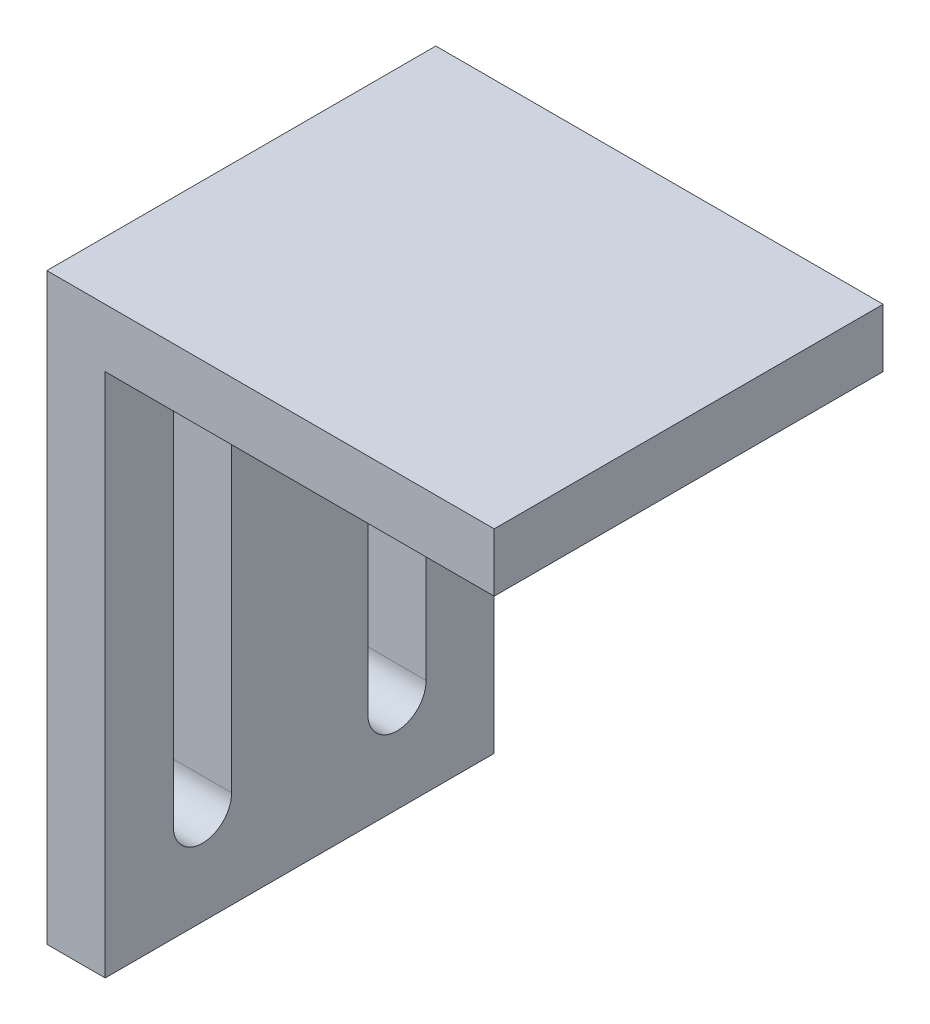
ISO-10303-21;
HEADER;
FILE_DESCRIPTION(('STEP AP214'),'2;1');
FILE_NAME('part.step','',(''),(''),'','','');
FILE_SCHEMA(('AUTOMOTIVE_DESIGN { 1 0 10303 214 1 1 1 1 }'));
ENDSEC;
DATA;
#1=APPLICATION_CONTEXT('core data for automotive mechanical design processes');
#2=APPLICATION_PROTOCOL_DEFINITION('international standard','automotive_design',2000,#1);
#3=PRODUCT_CONTEXT('',#1,'mechanical');
#4=PRODUCT('Part','Part','',(#3));
#5=PRODUCT_RELATED_PRODUCT_CATEGORY('part','',(#4));
#6=PRODUCT_DEFINITION_FORMATION('','',#4);
#7=PRODUCT_DEFINITION_CONTEXT('part definition',#1,'design');
#8=PRODUCT_DEFINITION('design','',#6,#7);
#9=PRODUCT_DEFINITION_SHAPE('','',#8);
#10=(LENGTH_UNIT() NAMED_UNIT(*) SI_UNIT(.MILLI.,.METRE.));
#11=(NAMED_UNIT(*) PLANE_ANGLE_UNIT() SI_UNIT($,.RADIAN.));
#12=(NAMED_UNIT(*) SI_UNIT($,.STERADIAN.) SOLID_ANGLE_UNIT());
#13=UNCERTAINTY_MEASURE_WITH_UNIT(LENGTH_MEASURE(1.E-05),#10,'distance_accuracy_value','');
#14=(GEOMETRIC_REPRESENTATION_CONTEXT(3) GLOBAL_UNCERTAINTY_ASSIGNED_CONTEXT((#13)) GLOBAL_UNIT_ASSIGNED_CONTEXT((#10,
#11,#12)) REPRESENTATION_CONTEXT('',''));
#15=CARTESIAN_POINT('',(0.,0.,0.));
#16=DIRECTION('',(0.,0.,1.));
#17=DIRECTION('',(1.,0.,0.));
#18=AXIS2_PLACEMENT_3D('',#15,#16,#17);
#19=CARTESIAN_POINT('',(3.,0.,0.));
#20=DIRECTION('',(1.,0.,0.));
#21=DIRECTION('',(0.,0.,-1.));
#22=AXIS2_PLACEMENT_3D('',#19,#20,#21);
#23=PLANE('',#22);
#24=DIRECTION('',(0.,0.,-1.));
#25=VECTOR('',#24,1.);
#26=CARTESIAN_POINT('',(3.,12.,10.));
#27=LINE('',#26,#25);
#28=CARTESIAN_POINT('',(3.,12.,10.));
#29=VERTEX_POINT('',#28);
#30=CARTESIAN_POINT('',(3.,12.,-10.));
#31=VERTEX_POINT('',#30);
#32=EDGE_CURVE('E52',#29,#31,#27,.T.);
#33=ORIENTED_EDGE('',*,*,#32,.F.);
#34=DIRECTION('',(0.,-1.,0.));
#35=VECTOR('',#34,1.);
#36=CARTESIAN_POINT('',(3.,15.,10.));
#37=LINE('',#36,#35);
#38=CARTESIAN_POINT('',(3.,-15.,10.));
#39=VERTEX_POINT('',#38);
#40=EDGE_CURVE('E161',#29,#39,#37,.T.);
#41=ORIENTED_EDGE('',*,*,#40,.T.);
#42=DIRECTION('',(0.,0.,-1.));
#43=VECTOR('',#42,1.);
#44=CARTESIAN_POINT('',(3.,-15.,10.));
#45=LINE('',#44,#43);
#46=CARTESIAN_POINT('',(3.,-15.,-10.));
#47=VERTEX_POINT('',#46);
#48=EDGE_CURVE('E248',#39,#47,#45,.T.);
#49=ORIENTED_EDGE('',*,*,#48,.T.);
#50=DIRECTION('',(0.,1.,0.));
#51=VECTOR('',#50,1.);
#52=CARTESIAN_POINT('',(3.,15.,-10.));
#53=LINE('',#52,#51);
#54=EDGE_CURVE('E238',#47,#31,#53,.T.);
#55=ORIENTED_EDGE('',*,*,#54,.T.);
#56=EDGE_LOOP('',(#33,#41,#49,#55));
#57=FACE_BOUND('',#56,.T.);
#58=DIRECTION('',(0.,-1.,0.));
#59=VECTOR('',#58,1.);
#60=CARTESIAN_POINT('',(3.,10.,6.5));
#61=LINE('',#60,#59);
#62=CARTESIAN_POINT('',(3.,10.,6.5));
#63=VERTEX_POINT('',#62);
#64=CARTESIAN_POINT('',(3.,-10.,6.5));
#65=VERTEX_POINT('',#64);
#66=EDGE_CURVE('E206',#63,#65,#61,.T.);
#67=ORIENTED_EDGE('',*,*,#66,.F.);
#68=CARTESIAN_POINT('',(3.,10.,5.));
#69=DIRECTION('',(1.,0.,0.));
#70=DIRECTION('',(0.,0.,-1.));
#71=AXIS2_PLACEMENT_3D('',#68,#69,#70);
#72=CIRCLE('',#71,1.5);
#73=CARTESIAN_POINT('',(3.,10.,3.5));
#74=VERTEX_POINT('',#73);
#75=EDGE_CURVE('E204',#74,#63,#72,.T.);
#76=ORIENTED_EDGE('',*,*,#75,.F.);
#77=DIRECTION('',(0.,1.,0.));
#78=VECTOR('',#77,1.);
#79=CARTESIAN_POINT('',(3.,10.,3.5));
#80=LINE('',#79,#78);
#81=CARTESIAN_POINT('',(3.,-10.,3.5));
#82=VERTEX_POINT('',#81);
#83=EDGE_CURVE('E212',#82,#74,#80,.T.);
#84=ORIENTED_EDGE('',*,*,#83,.F.);
#85=CARTESIAN_POINT('',(3.,-10.,5.));
#86=DIRECTION('',(1.,0.,0.));
#87=DIRECTION('',(0.,0.,-1.));
#88=AXIS2_PLACEMENT_3D('',#85,#86,#87);
#89=CIRCLE('',#88,1.5);
#90=EDGE_CURVE('E209',#65,#82,#89,.T.);
#91=ORIENTED_EDGE('',*,*,#90,.F.);
#92=EDGE_LOOP('',(#67,#76,#84,#91));
#93=FACE_BOUND('',#92,.T.);
#94=DIRECTION('',(0.,-1.,0.));
#95=VECTOR('',#94,1.);
#96=CARTESIAN_POINT('',(3.,10.,-3.5));
#97=LINE('',#96,#95);
#98=CARTESIAN_POINT('',(3.,10.,-3.5));
#99=VERTEX_POINT('',#98);
#100=CARTESIAN_POINT('',(3.,-10.,-3.5));
#101=VERTEX_POINT('',#100);
#102=EDGE_CURVE('E180',#99,#101,#97,.T.);
#103=ORIENTED_EDGE('',*,*,#102,.F.);
#104=CARTESIAN_POINT('',(3.,10.,-5.));
#105=DIRECTION('',(1.,0.,0.));
#106=DIRECTION('',(0.,0.,-1.));
#107=AXIS2_PLACEMENT_3D('',#104,#105,#106);
#108=CIRCLE('',#107,1.5);
#109=CARTESIAN_POINT('',(3.,10.,-6.5));
#110=VERTEX_POINT('',#109);
#111=EDGE_CURVE('E178',#110,#99,#108,.T.);
#112=ORIENTED_EDGE('',*,*,#111,.F.);
#113=DIRECTION('',(0.,1.,0.));
#114=VECTOR('',#113,1.);
#115=CARTESIAN_POINT('',(3.,10.,-6.5));
#116=LINE('',#115,#114);
#117=CARTESIAN_POINT('',(3.,-10.,-6.5));
#118=VERTEX_POINT('',#117);
#119=EDGE_CURVE('E185',#118,#110,#116,.T.);
#120=ORIENTED_EDGE('',*,*,#119,.F.);
#121=CARTESIAN_POINT('',(3.,-10.,-5.));
#122=DIRECTION('',(1.,0.,0.));
#123=DIRECTION('',(0.,0.,-1.));
#124=AXIS2_PLACEMENT_3D('',#121,#122,#123);
#125=CIRCLE('',#124,1.5);
#126=EDGE_CURVE('E183',#101,#118,#125,.T.);
#127=ORIENTED_EDGE('',*,*,#126,.F.);
#128=EDGE_LOOP('',(#103,#112,#120,#127));
#129=FACE_BOUND('',#128,.T.);
#130=ADVANCED_FACE('F35',(#57,#93,#129),#23,.T.);
#131=CARTESIAN_POINT('',(0.,0.,0.));
#132=DIRECTION('',(1.,0.,0.));
#133=DIRECTION('',(0.,0.,-1.));
#134=AXIS2_PLACEMENT_3D('',#131,#132,#133);
#135=PLANE('',#134);
#136=CARTESIAN_POINT('',(0.,10.,5.));
#137=DIRECTION('',(1.,0.,0.));
#138=DIRECTION('',(0.,0.,-1.));
#139=AXIS2_PLACEMENT_3D('',#136,#137,#138);
#140=CIRCLE('',#139,1.5);
#141=CARTESIAN_POINT('',(0.,10.,3.5));
#142=VERTEX_POINT('',#141);
#143=CARTESIAN_POINT('',(0.,10.,6.5));
#144=VERTEX_POINT('',#143);
#145=EDGE_CURVE('E203',#142,#144,#140,.T.);
#146=ORIENTED_EDGE('',*,*,#145,.T.);
#147=DIRECTION('',(0.,-1.,0.));
#148=VECTOR('',#147,1.);
#149=CARTESIAN_POINT('',(0.,10.,6.5));
#150=LINE('',#149,#148);
#151=CARTESIAN_POINT('',(0.,-10.,6.5));
#152=VERTEX_POINT('',#151);
#153=EDGE_CURVE('E217',#144,#152,#150,.T.);
#154=ORIENTED_EDGE('',*,*,#153,.T.);
#155=CARTESIAN_POINT('',(0.,-10.,5.));
#156=DIRECTION('',(1.,0.,0.));
#157=DIRECTION('',(0.,0.,-1.));
#158=AXIS2_PLACEMENT_3D('',#155,#156,#157);
#159=CIRCLE('',#158,1.5);
#160=CARTESIAN_POINT('',(0.,-10.,3.5));
#161=VERTEX_POINT('',#160);
#162=EDGE_CURVE('E220',#152,#161,#159,.T.);
#163=ORIENTED_EDGE('',*,*,#162,.T.);
#164=DIRECTION('',(0.,1.,0.));
#165=VECTOR('',#164,1.);
#166=CARTESIAN_POINT('',(0.,10.,3.5));
#167=LINE('',#166,#165);
#168=EDGE_CURVE('E207',#161,#142,#167,.T.);
#169=ORIENTED_EDGE('',*,*,#168,.T.);
#170=EDGE_LOOP('',(#146,#154,#163,#169));
#171=FACE_BOUND('',#170,.T.);
#172=DIRECTION('',(0.,1.,0.));
#173=VECTOR('',#172,1.);
#174=CARTESIAN_POINT('',(0.,15.,-10.));
#175=LINE('',#174,#173);
#176=CARTESIAN_POINT('',(0.,-15.,-10.));
#177=VERTEX_POINT('',#176);
#178=CARTESIAN_POINT('',(0.,15.,-10.));
#179=VERTEX_POINT('',#178);
#180=EDGE_CURVE('E234',#177,#179,#175,.T.);
#181=ORIENTED_EDGE('',*,*,#180,.F.);
#182=DIRECTION('',(0.,0.,-1.));
#183=VECTOR('',#182,1.);
#184=CARTESIAN_POINT('',(0.,-15.,10.));
#185=LINE('',#184,#183);
#186=CARTESIAN_POINT('',(0.,-15.,10.));
#187=VERTEX_POINT('',#186);
#188=EDGE_CURVE('E239',#187,#177,#185,.T.);
#189=ORIENTED_EDGE('',*,*,#188,.F.);
#190=DIRECTION('',(0.,-1.,0.));
#191=VECTOR('',#190,1.);
#192=CARTESIAN_POINT('',(0.,15.,10.));
#193=LINE('',#192,#191);
#194=CARTESIAN_POINT('',(0.,15.,10.));
#195=VERTEX_POINT('',#194);
#196=EDGE_CURVE('E250',#195,#187,#193,.T.);
#197=ORIENTED_EDGE('',*,*,#196,.F.);
#198=DIRECTION('',(0.,0.,1.));
#199=VECTOR('',#198,1.);
#200=CARTESIAN_POINT('',(0.,15.,10.));
#201=LINE('',#200,#199);
#202=EDGE_CURVE('E252',#179,#195,#201,.T.);
#203=ORIENTED_EDGE('',*,*,#202,.F.);
#204=EDGE_LOOP('',(#181,#189,#197,#203));
#205=FACE_BOUND('',#204,.T.);
#206=CARTESIAN_POINT('',(0.,10.,-5.));
#207=DIRECTION('',(1.,0.,0.));
#208=DIRECTION('',(0.,0.,-1.));
#209=AXIS2_PLACEMENT_3D('',#206,#207,#208);
#210=CIRCLE('',#209,1.5);
#211=CARTESIAN_POINT('',(0.,10.,-6.5));
#212=VERTEX_POINT('',#211);
#213=CARTESIAN_POINT('',(0.,10.,-3.5));
#214=VERTEX_POINT('',#213);
#215=EDGE_CURVE('E162',#212,#214,#210,.T.);
#216=ORIENTED_EDGE('',*,*,#215,.T.);
#217=DIRECTION('',(0.,-1.,0.));
#218=VECTOR('',#217,1.);
#219=CARTESIAN_POINT('',(0.,10.,-3.5));
#220=LINE('',#219,#218);
#221=CARTESIAN_POINT('',(0.,-10.,-3.5));
#222=VERTEX_POINT('',#221);
#223=EDGE_CURVE('E164',#214,#222,#220,.T.);
#224=ORIENTED_EDGE('',*,*,#223,.T.);
#225=CARTESIAN_POINT('',(0.,-10.,-5.));
#226=DIRECTION('',(1.,0.,0.));
#227=DIRECTION('',(0.,0.,-1.));
#228=AXIS2_PLACEMENT_3D('',#225,#226,#227);
#229=CIRCLE('',#228,1.5);
#230=CARTESIAN_POINT('',(0.,-10.,-6.5));
#231=VERTEX_POINT('',#230);
#232=EDGE_CURVE('E190',#222,#231,#229,.T.);
#233=ORIENTED_EDGE('',*,*,#232,.T.);
#234=DIRECTION('',(0.,1.,0.));
#235=VECTOR('',#234,1.);
#236=CARTESIAN_POINT('',(0.,10.,-6.5));
#237=LINE('',#236,#235);
#238=EDGE_CURVE('E181',#231,#212,#237,.T.);
#239=ORIENTED_EDGE('',*,*,#238,.T.);
#240=EDGE_LOOP('',(#216,#224,#233,#239));
#241=FACE_BOUND('',#240,.T.);
#242=ADVANCED_FACE('F268',(#171,#205,#241),#135,.F.);
#243=CARTESIAN_POINT('',(3.,15.,-10.));
#244=DIRECTION('',(0.,0.,1.));
#245=DIRECTION('',(0.,-1.,0.));
#246=AXIS2_PLACEMENT_3D('',#243,#244,#245);
#247=PLANE('',#246);
#248=ORIENTED_EDGE('',*,*,#180,.T.);
#249=DIRECTION('',(-1.,0.,0.));
#250=VECTOR('',#249,1.);
#251=CARTESIAN_POINT('',(3.,15.,-10.));
#252=LINE('',#251,#250);
#253=CARTESIAN_POINT('',(23.,15.,-10.));
#254=VERTEX_POINT('',#253);
#255=EDGE_CURVE('E11',#254,#179,#252,.T.);
#256=ORIENTED_EDGE('',*,*,#255,.F.);
#257=DIRECTION('',(0.,1.,0.));
#258=VECTOR('',#257,1.);
#259=CARTESIAN_POINT('',(23.,15.,-10.));
#260=LINE('',#259,#258);
#261=CARTESIAN_POINT('',(23.,12.,-10.));
#262=VERTEX_POINT('',#261);
#263=EDGE_CURVE('E148',#262,#254,#260,.T.);
#264=ORIENTED_EDGE('',*,*,#263,.F.);
#265=DIRECTION('',(-1.,0.,0.));
#266=VECTOR('',#265,1.);
#267=CARTESIAN_POINT('',(23.,12.,-10.));
#268=LINE('',#267,#266);
#269=EDGE_CURVE('E144',#262,#31,#268,.T.);
#270=ORIENTED_EDGE('',*,*,#269,.T.);
#271=ORIENTED_EDGE('',*,*,#54,.F.);
#272=DIRECTION('',(-1.,0.,0.));
#273=VECTOR('',#272,1.);
#274=CARTESIAN_POINT('',(3.,-15.,-10.));
#275=LINE('',#274,#273);
#276=EDGE_CURVE('E245',#47,#177,#275,.T.);
#277=ORIENTED_EDGE('',*,*,#276,.T.);
#278=EDGE_LOOP('',(#248,#256,#264,#270,#271,#277));
#279=FACE_BOUND('',#278,.T.);
#280=ADVANCED_FACE('F37',(#279),#247,.F.);
#281=CARTESIAN_POINT('',(3.,15.,10.));
#282=DIRECTION('',(0.,-1.,0.));
#283=DIRECTION('',(0.,0.,-1.));
#284=AXIS2_PLACEMENT_3D('',#281,#282,#283);
#285=PLANE('',#284);
#286=ORIENTED_EDGE('',*,*,#202,.T.);
#287=DIRECTION('',(-1.,0.,0.));
#288=VECTOR('',#287,1.);
#289=CARTESIAN_POINT('',(3.,15.,10.));
#290=LINE('',#289,#288);
#291=CARTESIAN_POINT('',(23.,15.,10.));
#292=VERTEX_POINT('',#291);
#293=EDGE_CURVE('E44',#292,#195,#290,.T.);
#294=ORIENTED_EDGE('',*,*,#293,.F.);
#295=DIRECTION('',(0.,0.,1.));
#296=VECTOR('',#295,1.);
#297=CARTESIAN_POINT('',(23.,15.,10.));
#298=LINE('',#297,#296);
#299=EDGE_CURVE('E155',#254,#292,#298,.T.);
#300=ORIENTED_EDGE('',*,*,#299,.F.);
#301=ORIENTED_EDGE('',*,*,#255,.T.);
#302=EDGE_LOOP('',(#286,#294,#300,#301));
#303=FACE_BOUND('',#302,.T.);
#304=ADVANCED_FACE('F266',(#303),#285,.F.);
#305=CARTESIAN_POINT('',(3.,15.,10.));
#306=DIRECTION('',(0.,0.,-1.));
#307=DIRECTION('',(0.,1.,0.));
#308=AXIS2_PLACEMENT_3D('',#305,#306,#307);
#309=PLANE('',#308);
#310=ORIENTED_EDGE('',*,*,#196,.T.);
#311=DIRECTION('',(-1.,0.,0.));
#312=VECTOR('',#311,1.);
#313=CARTESIAN_POINT('',(3.,-15.,10.));
#314=LINE('',#313,#312);
#315=EDGE_CURVE('E242',#39,#187,#314,.T.);
#316=ORIENTED_EDGE('',*,*,#315,.F.);
#317=ORIENTED_EDGE('',*,*,#40,.F.);
#318=DIRECTION('',(-1.,0.,0.));
#319=VECTOR('',#318,1.);
#320=CARTESIAN_POINT('',(23.,12.,10.));
#321=LINE('',#320,#319);
#322=CARTESIAN_POINT('',(23.,12.,10.));
#323=VERTEX_POINT('',#322);
#324=EDGE_CURVE('E142',#323,#29,#321,.T.);
#325=ORIENTED_EDGE('',*,*,#324,.F.);
#326=DIRECTION('',(0.,-1.,0.));
#327=VECTOR('',#326,1.);
#328=CARTESIAN_POINT('',(23.,15.,10.));
#329=LINE('',#328,#327);
#330=EDGE_CURVE('E149',#292,#323,#329,.T.);
#331=ORIENTED_EDGE('',*,*,#330,.F.);
#332=ORIENTED_EDGE('',*,*,#293,.T.);
#333=EDGE_LOOP('',(#310,#316,#317,#325,#331,#332));
#334=FACE_BOUND('',#333,.T.);
#335=ADVANCED_FACE('F159',(#334),#309,.F.);
#336=CARTESIAN_POINT('',(3.,-15.,10.));
#337=DIRECTION('',(0.,1.,0.));
#338=DIRECTION('',(0.,0.,1.));
#339=AXIS2_PLACEMENT_3D('',#336,#337,#338);
#340=PLANE('',#339);
#341=ORIENTED_EDGE('',*,*,#188,.T.);
#342=ORIENTED_EDGE('',*,*,#276,.F.);
#343=ORIENTED_EDGE('',*,*,#48,.F.);
#344=ORIENTED_EDGE('',*,*,#315,.T.);
#345=EDGE_LOOP('',(#341,#342,#343,#344));
#346=FACE_BOUND('',#345,.T.);
#347=ADVANCED_FACE('F261',(#346),#340,.F.);
#348=CARTESIAN_POINT('',(3.,10.,5.));
#349=DIRECTION('',(-1.,0.,0.));
#350=DIRECTION('',(0.,0.,1.));
#351=AXIS2_PLACEMENT_3D('',#348,#349,#350);
#352=CYLINDRICAL_SURFACE('',#351,1.5);
#353=ORIENTED_EDGE('',*,*,#145,.F.);
#354=DIRECTION('',(-1.,0.,0.));
#355=VECTOR('',#354,1.);
#356=CARTESIAN_POINT('',(3.,10.,3.5));
#357=LINE('',#356,#355);
#358=EDGE_CURVE('E214',#74,#142,#357,.T.);
#359=ORIENTED_EDGE('',*,*,#358,.F.);
#360=ORIENTED_EDGE('',*,*,#75,.T.);
#361=DIRECTION('',(-1.,0.,0.));
#362=VECTOR('',#361,1.);
#363=CARTESIAN_POINT('',(3.,10.,6.5));
#364=LINE('',#363,#362);
#365=EDGE_CURVE('E231',#63,#144,#364,.T.);
#366=ORIENTED_EDGE('',*,*,#365,.T.);
#367=EDGE_LOOP('',(#353,#359,#360,#366));
#368=FACE_BOUND('',#367,.T.);
#369=ADVANCED_FACE('F302',(#368),#352,.F.);
#370=CARTESIAN_POINT('',(3.,10.,6.5));
#371=DIRECTION('',(0.,0.,-1.));
#372=DIRECTION('',(0.,1.,0.));
#373=AXIS2_PLACEMENT_3D('',#370,#371,#372);
#374=PLANE('',#373);
#375=ORIENTED_EDGE('',*,*,#153,.F.);
#376=ORIENTED_EDGE('',*,*,#365,.F.);
#377=ORIENTED_EDGE('',*,*,#66,.T.);
#378=DIRECTION('',(-1.,0.,0.));
#379=VECTOR('',#378,1.);
#380=CARTESIAN_POINT('',(3.,-10.,6.5));
#381=LINE('',#380,#379);
#382=EDGE_CURVE('E229',#65,#152,#381,.T.);
#383=ORIENTED_EDGE('',*,*,#382,.T.);
#384=EDGE_LOOP('',(#375,#376,#377,#383));
#385=FACE_BOUND('',#384,.T.);
#386=ADVANCED_FACE('F336',(#385),#374,.T.);
#387=CARTESIAN_POINT('',(3.,-10.,5.));
#388=DIRECTION('',(-1.,0.,0.));
#389=DIRECTION('',(0.,0.,1.));
#390=AXIS2_PLACEMENT_3D('',#387,#388,#389);
#391=CYLINDRICAL_SURFACE('',#390,1.5);
#392=ORIENTED_EDGE('',*,*,#162,.F.);
#393=ORIENTED_EDGE('',*,*,#382,.F.);
#394=ORIENTED_EDGE('',*,*,#90,.T.);
#395=DIRECTION('',(-1.,0.,0.));
#396=VECTOR('',#395,1.);
#397=CARTESIAN_POINT('',(3.,-10.,3.5));
#398=LINE('',#397,#396);
#399=EDGE_CURVE('E227',#82,#161,#398,.T.);
#400=ORIENTED_EDGE('',*,*,#399,.T.);
#401=EDGE_LOOP('',(#392,#393,#394,#400));
#402=FACE_BOUND('',#401,.T.);
#403=ADVANCED_FACE('F345',(#402),#391,.F.);
#404=CARTESIAN_POINT('',(3.,10.,3.5));
#405=DIRECTION('',(0.,0.,1.));
#406=DIRECTION('',(0.,-1.,0.));
#407=AXIS2_PLACEMENT_3D('',#404,#405,#406);
#408=PLANE('',#407);
#409=ORIENTED_EDGE('',*,*,#168,.F.);
#410=ORIENTED_EDGE('',*,*,#399,.F.);
#411=ORIENTED_EDGE('',*,*,#83,.T.);
#412=ORIENTED_EDGE('',*,*,#358,.T.);
#413=EDGE_LOOP('',(#409,#410,#411,#412));
#414=FACE_BOUND('',#413,.T.);
#415=ADVANCED_FACE('F354',(#414),#408,.T.);
#416=CARTESIAN_POINT('',(3.,10.,-5.));
#417=DIRECTION('',(-1.,0.,0.));
#418=DIRECTION('',(0.,0.,1.));
#419=AXIS2_PLACEMENT_3D('',#416,#417,#418);
#420=CYLINDRICAL_SURFACE('',#419,1.5);
#421=ORIENTED_EDGE('',*,*,#215,.F.);
#422=DIRECTION('',(-1.,0.,0.));
#423=VECTOR('',#422,1.);
#424=CARTESIAN_POINT('',(3.,10.,-6.5));
#425=LINE('',#424,#423);
#426=EDGE_CURVE('E186',#110,#212,#425,.T.);
#427=ORIENTED_EDGE('',*,*,#426,.F.);
#428=ORIENTED_EDGE('',*,*,#111,.T.);
#429=DIRECTION('',(-1.,0.,0.));
#430=VECTOR('',#429,1.);
#431=CARTESIAN_POINT('',(3.,10.,-3.5));
#432=LINE('',#431,#430);
#433=EDGE_CURVE('E200',#99,#214,#432,.T.);
#434=ORIENTED_EDGE('',*,*,#433,.T.);
#435=EDGE_LOOP('',(#421,#427,#428,#434));
#436=FACE_BOUND('',#435,.T.);
#437=ADVANCED_FACE('F275',(#436),#420,.F.);
#438=CARTESIAN_POINT('',(3.,10.,-3.5));
#439=DIRECTION('',(0.,0.,-1.));
#440=DIRECTION('',(0.,1.,0.));
#441=AXIS2_PLACEMENT_3D('',#438,#439,#440);
#442=PLANE('',#441);
#443=ORIENTED_EDGE('',*,*,#223,.F.);
#444=ORIENTED_EDGE('',*,*,#433,.F.);
#445=ORIENTED_EDGE('',*,*,#102,.T.);
#446=DIRECTION('',(-1.,0.,0.));
#447=VECTOR('',#446,1.);
#448=CARTESIAN_POINT('',(3.,-10.,-3.5));
#449=LINE('',#448,#447);
#450=EDGE_CURVE('E198',#101,#222,#449,.T.);
#451=ORIENTED_EDGE('',*,*,#450,.T.);
#452=EDGE_LOOP('',(#443,#444,#445,#451));
#453=FACE_BOUND('',#452,.T.);
#454=ADVANCED_FACE('F284',(#453),#442,.T.);
#455=CARTESIAN_POINT('',(3.,-10.,-5.));
#456=DIRECTION('',(-1.,0.,0.));
#457=DIRECTION('',(0.,0.,1.));
#458=AXIS2_PLACEMENT_3D('',#455,#456,#457);
#459=CYLINDRICAL_SURFACE('',#458,1.5);
#460=ORIENTED_EDGE('',*,*,#232,.F.);
#461=ORIENTED_EDGE('',*,*,#450,.F.);
#462=ORIENTED_EDGE('',*,*,#126,.T.);
#463=DIRECTION('',(-1.,0.,0.));
#464=VECTOR('',#463,1.);
#465=CARTESIAN_POINT('',(3.,-10.,-6.5));
#466=LINE('',#465,#464);
#467=EDGE_CURVE('E60',#118,#231,#466,.T.);
#468=ORIENTED_EDGE('',*,*,#467,.T.);
#469=EDGE_LOOP('',(#460,#461,#462,#468));
#470=FACE_BOUND('',#469,.T.);
#471=ADVANCED_FACE('F288',(#470),#459,.F.);
#472=CARTESIAN_POINT('',(3.,10.,-6.5));
#473=DIRECTION('',(0.,0.,1.));
#474=DIRECTION('',(0.,-1.,0.));
#475=AXIS2_PLACEMENT_3D('',#472,#473,#474);
#476=PLANE('',#475);
#477=ORIENTED_EDGE('',*,*,#238,.F.);
#478=ORIENTED_EDGE('',*,*,#467,.F.);
#479=ORIENTED_EDGE('',*,*,#119,.T.);
#480=ORIENTED_EDGE('',*,*,#426,.T.);
#481=EDGE_LOOP('',(#477,#478,#479,#480));
#482=FACE_BOUND('',#481,.T.);
#483=ADVANCED_FACE('F278',(#482),#476,.T.);
#484=CARTESIAN_POINT('',(23.,12.,10.));
#485=DIRECTION('',(0.,1.,0.));
#486=DIRECTION('',(0.,0.,1.));
#487=AXIS2_PLACEMENT_3D('',#484,#485,#486);
#488=PLANE('',#487);
#489=ORIENTED_EDGE('',*,*,#32,.T.);
#490=ORIENTED_EDGE('',*,*,#269,.F.);
#491=DIRECTION('',(0.,0.,-1.));
#492=VECTOR('',#491,1.);
#493=CARTESIAN_POINT('',(23.,12.,10.));
#494=LINE('',#493,#492);
#495=EDGE_CURVE('E138',#323,#262,#494,.T.);
#496=ORIENTED_EDGE('',*,*,#495,.F.);
#497=ORIENTED_EDGE('',*,*,#324,.T.);
#498=EDGE_LOOP('',(#489,#490,#496,#497));
#499=FACE_BOUND('',#498,.T.);
#500=ADVANCED_FACE('F140',(#499),#488,.F.);
#501=CARTESIAN_POINT('',(23.,0.,0.));
#502=DIRECTION('',(1.,0.,0.));
#503=DIRECTION('',(0.,0.,-1.));
#504=AXIS2_PLACEMENT_3D('',#501,#502,#503);
#505=PLANE('',#504);
#506=ORIENTED_EDGE('',*,*,#330,.T.);
#507=ORIENTED_EDGE('',*,*,#495,.T.);
#508=ORIENTED_EDGE('',*,*,#263,.T.);
#509=ORIENTED_EDGE('',*,*,#299,.T.);
#510=EDGE_LOOP('',(#506,#507,#508,#509));
#511=FACE_BOUND('',#510,.T.);
#512=ADVANCED_FACE('F153',(#511),#505,.T.);
#513=CLOSED_SHELL('',(#130,#242,#280,#304,#335,#347,#369,#386,#403,#415,#437,#454,#471,#483,
#500,#512));
#514=MANIFOLD_SOLID_BREP('B2',#513);
#515=ADVANCED_BREP_SHAPE_REPRESENTATION('',(#18,#514),#14);
#516=SHAPE_DEFINITION_REPRESENTATION(#9,#515);
ENDSEC;
END-ISO-10303-21;
